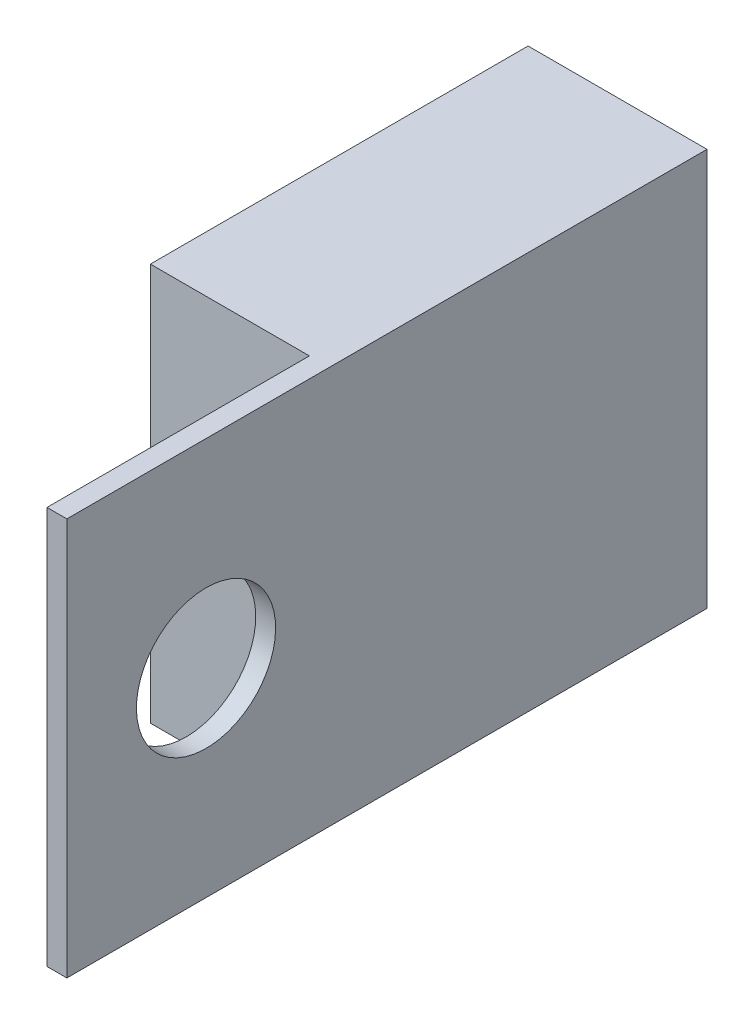
ISO-10303-21;
HEADER;
FILE_DESCRIPTION(('STEP AP214'),'2;1');
FILE_NAME('part.step','',(''),(''),'','','');
FILE_SCHEMA(('AUTOMOTIVE_DESIGN { 1 0 10303 214 1 1 1 1 }'));
ENDSEC;
DATA;
#1=APPLICATION_CONTEXT('core data for automotive mechanical design processes');
#2=APPLICATION_PROTOCOL_DEFINITION('international standard','automotive_design',2000,#1);
#3=PRODUCT_CONTEXT('',#1,'mechanical');
#4=PRODUCT('Part','Part','',(#3));
#5=PRODUCT_RELATED_PRODUCT_CATEGORY('part','',(#4));
#6=PRODUCT_DEFINITION_FORMATION('','',#4);
#7=PRODUCT_DEFINITION_CONTEXT('part definition',#1,'design');
#8=PRODUCT_DEFINITION('design','',#6,#7);
#9=PRODUCT_DEFINITION_SHAPE('','',#8);
#10=(LENGTH_UNIT() NAMED_UNIT(*) SI_UNIT(.MILLI.,.METRE.));
#11=(NAMED_UNIT(*) PLANE_ANGLE_UNIT() SI_UNIT($,.RADIAN.));
#12=(NAMED_UNIT(*) SI_UNIT($,.STERADIAN.) SOLID_ANGLE_UNIT());
#13=UNCERTAINTY_MEASURE_WITH_UNIT(LENGTH_MEASURE(1.E-05),#10,'distance_accuracy_value','');
#14=(GEOMETRIC_REPRESENTATION_CONTEXT(3) GLOBAL_UNCERTAINTY_ASSIGNED_CONTEXT((#13)) GLOBAL_UNIT_ASSIGNED_CONTEXT((#10,
#11,#12)) REPRESENTATION_CONTEXT('',''));
#15=CARTESIAN_POINT('',(0.,0.,0.));
#16=DIRECTION('',(0.,0.,1.));
#17=DIRECTION('',(1.,0.,0.));
#18=AXIS2_PLACEMENT_3D('',#15,#16,#17);
#19=CARTESIAN_POINT('',(-45.3217987061,12.6154747009,17.2));
#20=DIRECTION('',(1.,0.,0.));
#21=DIRECTION('',(0.,0.87758256189038,0.479425538604189));
#22=AXIS2_PLACEMENT_3D('',#19,#20,#21);
#23=CYLINDRICAL_SURFACE('',#22,1.75);
#24=CARTESIAN_POINT('',(49.1288757324,12.6154747009,17.2));
#25=DIRECTION('',(-1.,0.,0.));
#26=DIRECTION('',(0.,0.877582561879051,0.479425538624928));
#27=AXIS2_PLACEMENT_3D('',#24,#25,#26);
#28=CIRCLE('',#27,1.75);
#29=CARTESIAN_POINT('',(49.1288757324,14.1512441841883,18.0389946925936));
#30=VERTEX_POINT('',#29);
#31=EDGE_CURVE('E98',#30,#30,#28,.T.);
#32=ORIENTED_EDGE('',*,*,#31,.F.);
#33=EDGE_LOOP('',(#32));
#34=FACE_BOUND('',#33,.T.);
#35=CARTESIAN_POINT('',(48.6288757324,12.6154747009,17.2));
#36=DIRECTION('',(1.,0.,0.));
#37=DIRECTION('',(0.,-0.877582561879051,-0.479425538624928));
#38=AXIS2_PLACEMENT_3D('',#35,#36,#37);
#39=CIRCLE('',#38,1.75);
#40=CARTESIAN_POINT('',(48.6288757324,11.0797052176117,16.3610053074064));
#41=VERTEX_POINT('',#40);
#42=EDGE_CURVE('E114',#41,#41,#39,.T.);
#43=ORIENTED_EDGE('',*,*,#42,.F.);
#44=EDGE_LOOP('',(#43));
#45=FACE_BOUND('',#44,.T.);
#46=ADVANCED_FACE('F17',(#34,#45),#23,.F.);
#47=CARTESIAN_POINT('',(48.6288757324,7.61547470093,14.1));
#48=DIRECTION('',(1.,0.,0.));
#49=DIRECTION('',(0.,1.,0.));
#50=AXIS2_PLACEMENT_3D('',#47,#48,#49);
#51=PLANE('',#50);
#52=DIRECTION('',(0.,1.,0.));
#53=VECTOR('',#52,1.);
#54=CARTESIAN_POINT('',(48.6288757324,7.61547470093,14.1));
#55=LINE('',#54,#53);
#56=CARTESIAN_POINT('',(48.6288757324,7.61547470093,14.1));
#57=VERTEX_POINT('',#56);
#58=CARTESIAN_POINT('',(48.6288757324,17.6154747009,14.1));
#59=VERTEX_POINT('',#58);
#60=EDGE_CURVE('E36',#57,#59,#55,.T.);
#61=ORIENTED_EDGE('',*,*,#60,.F.);
#62=DIRECTION('',(0.,0.,-1.));
#63=VECTOR('',#62,1.);
#64=CARTESIAN_POINT('',(48.6288757324,7.61547470093,20.7));
#65=LINE('',#64,#63);
#66=CARTESIAN_POINT('',(48.6288757324,7.61547470093,20.7));
#67=VERTEX_POINT('',#66);
#68=EDGE_CURVE('E81',#67,#57,#65,.T.);
#69=ORIENTED_EDGE('',*,*,#68,.F.);
#70=DIRECTION('',(0.,1.,0.));
#71=VECTOR('',#70,1.);
#72=CARTESIAN_POINT('',(48.6288757324,7.61547470093,20.7));
#73=LINE('',#72,#71);
#74=CARTESIAN_POINT('',(48.6288757324,17.6154747009,20.7));
#75=VERTEX_POINT('',#74);
#76=EDGE_CURVE('E11',#67,#75,#73,.T.);
#77=ORIENTED_EDGE('',*,*,#76,.T.);
#78=DIRECTION('',(0.,0.,-1.));
#79=VECTOR('',#78,1.);
#80=CARTESIAN_POINT('',(48.6288757324,17.6154747009,20.7));
#81=LINE('',#80,#79);
#82=EDGE_CURVE('E27',#75,#59,#81,.T.);
#83=ORIENTED_EDGE('',*,*,#82,.T.);
#84=EDGE_LOOP('',(#61,#69,#77,#83));
#85=FACE_BOUND('',#84,.T.);
#86=ORIENTED_EDGE('',*,*,#42,.T.);
#87=EDGE_LOOP('',(#86));
#88=FACE_BOUND('',#87,.T.);
#89=ADVANCED_FACE('F128',(#85,#88),#51,.F.);
#90=CARTESIAN_POINT('',(-45.4217987061,17.6154747009,1.6));
#91=DIRECTION('',(0.,-1.,0.));
#92=DIRECTION('',(1.,0.,0.));
#93=AXIS2_PLACEMENT_3D('',#90,#91,#92);
#94=PLANE('',#93);
#95=DIRECTION('',(1.,0.,0.));
#96=VECTOR('',#95,1.);
#97=CARTESIAN_POINT('',(44.6288757324,17.6154747009,4.6));
#98=LINE('',#97,#96);
#99=CARTESIAN_POINT('',(44.6288757324,17.6154747009,4.6));
#100=VERTEX_POINT('',#99);
#101=CARTESIAN_POINT('',(49.1288757324,17.6154747009,4.6));
#102=VERTEX_POINT('',#101);
#103=EDGE_CURVE('E92',#100,#102,#98,.T.);
#104=ORIENTED_EDGE('',*,*,#103,.F.);
#105=DIRECTION('',(0.,0.,-1.));
#106=VECTOR('',#105,1.);
#107=CARTESIAN_POINT('',(44.6288757324,17.6154747009,14.1));
#108=LINE('',#107,#106);
#109=CARTESIAN_POINT('',(44.6288757324,17.6154747009,14.1));
#110=VERTEX_POINT('',#109);
#111=EDGE_CURVE('E90',#110,#100,#108,.T.);
#112=ORIENTED_EDGE('',*,*,#111,.F.);
#113=DIRECTION('',(1.,0.,0.));
#114=VECTOR('',#113,1.);
#115=CARTESIAN_POINT('',(44.6288757324,17.6154747009,14.1));
#116=LINE('',#115,#114);
#117=EDGE_CURVE('E111',#110,#59,#116,.T.);
#118=ORIENTED_EDGE('',*,*,#117,.T.);
#119=ORIENTED_EDGE('',*,*,#82,.F.);
#120=DIRECTION('',(1.,0.,0.));
#121=VECTOR('',#120,1.);
#122=CARTESIAN_POINT('',(48.6288757324,17.6154747009,20.7));
#123=LINE('',#122,#121);
#124=CARTESIAN_POINT('',(49.1288757324,17.6154747009,20.7));
#125=VERTEX_POINT('',#124);
#126=EDGE_CURVE('E108',#75,#125,#123,.T.);
#127=ORIENTED_EDGE('',*,*,#126,.T.);
#128=DIRECTION('',(0.,0.,-1.));
#129=VECTOR('',#128,1.);
#130=CARTESIAN_POINT('',(49.1288757324,17.6154747009,20.7));
#131=LINE('',#130,#129);
#132=EDGE_CURVE('E104',#125,#102,#131,.T.);
#133=ORIENTED_EDGE('',*,*,#132,.T.);
#134=EDGE_LOOP('',(#104,#112,#118,#119,#127,#133));
#135=FACE_BOUND('',#134,.T.);
#136=ADVANCED_FACE('F133',(#135),#94,.F.);
#137=CARTESIAN_POINT('',(49.1288757324,17.6154747009,1.6));
#138=DIRECTION('',(-1.,0.,0.));
#139=DIRECTION('',(0.,-1.,0.));
#140=AXIS2_PLACEMENT_3D('',#137,#138,#139);
#141=PLANE('',#140);
#142=DIRECTION('',(0.,-1.,0.));
#143=VECTOR('',#142,1.);
#144=CARTESIAN_POINT('',(49.1288757324,17.6154747009,4.6));
#145=LINE('',#144,#143);
#146=CARTESIAN_POINT('',(49.1288757324,7.61547470093,4.6));
#147=VERTEX_POINT('',#146);
#148=EDGE_CURVE('E78',#102,#147,#145,.T.);
#149=ORIENTED_EDGE('',*,*,#148,.F.);
#150=ORIENTED_EDGE('',*,*,#132,.F.);
#151=DIRECTION('',(0.,-1.,0.));
#152=VECTOR('',#151,1.);
#153=CARTESIAN_POINT('',(49.1288757324,17.6154747009,20.7));
#154=LINE('',#153,#152);
#155=CARTESIAN_POINT('',(49.1288757324,7.61547470093,20.7));
#156=VERTEX_POINT('',#155);
#157=EDGE_CURVE('E101',#125,#156,#154,.T.);
#158=ORIENTED_EDGE('',*,*,#157,.T.);
#159=DIRECTION('',(0.,0.,-1.));
#160=VECTOR('',#159,1.);
#161=CARTESIAN_POINT('',(49.1288757324,7.61547470093,20.7));
#162=LINE('',#161,#160);
#163=EDGE_CURVE('E99',#156,#147,#162,.T.);
#164=ORIENTED_EDGE('',*,*,#163,.T.);
#165=EDGE_LOOP('',(#149,#150,#158,#164));
#166=FACE_BOUND('',#165,.T.);
#167=ORIENTED_EDGE('',*,*,#31,.T.);
#168=EDGE_LOOP('',(#167));
#169=FACE_BOUND('',#168,.T.);
#170=ADVANCED_FACE('F124',(#166,#169),#141,.F.);
#171=CARTESIAN_POINT('',(-40.9217987061,7.61547470093,1.6));
#172=DIRECTION('',(0.,1.,0.));
#173=DIRECTION('',(-1.,0.,0.));
#174=AXIS2_PLACEMENT_3D('',#171,#172,#173);
#175=PLANE('',#174);
#176=DIRECTION('',(-1.,0.,0.));
#177=VECTOR('',#176,1.);
#178=CARTESIAN_POINT('',(48.6288757324,7.61547470093,14.1));
#179=LINE('',#178,#177);
#180=CARTESIAN_POINT('',(44.6288757324,7.61547470093,14.1));
#181=VERTEX_POINT('',#180);
#182=EDGE_CURVE('E85',#57,#181,#179,.T.);
#183=ORIENTED_EDGE('',*,*,#182,.T.);
#184=DIRECTION('',(0.,0.,-1.));
#185=VECTOR('',#184,1.);
#186=CARTESIAN_POINT('',(44.6288757324,7.61547470093,14.1));
#187=LINE('',#186,#185);
#188=CARTESIAN_POINT('',(44.6288757324,7.61547470093,4.6));
#189=VERTEX_POINT('',#188);
#190=EDGE_CURVE('E68',#181,#189,#187,.T.);
#191=ORIENTED_EDGE('',*,*,#190,.T.);
#192=DIRECTION('',(-1.,0.,0.));
#193=VECTOR('',#192,1.);
#194=CARTESIAN_POINT('',(49.1288757324,7.61547470093,4.6));
#195=LINE('',#194,#193);
#196=EDGE_CURVE('E74',#147,#189,#195,.T.);
#197=ORIENTED_EDGE('',*,*,#196,.F.);
#198=ORIENTED_EDGE('',*,*,#163,.F.);
#199=DIRECTION('',(-1.,0.,0.));
#200=VECTOR('',#199,1.);
#201=CARTESIAN_POINT('',(49.1288757324,7.61547470093,20.7));
#202=LINE('',#201,#200);
#203=EDGE_CURVE('E87',#156,#67,#202,.T.);
#204=ORIENTED_EDGE('',*,*,#203,.T.);
#205=ORIENTED_EDGE('',*,*,#68,.T.);
#206=EDGE_LOOP('',(#183,#191,#197,#198,#204,#205));
#207=FACE_BOUND('',#206,.T.);
#208=ADVANCED_FACE('F83',(#207),#175,.F.);
#209=CARTESIAN_POINT('',(0.,0.,20.7));
#210=DIRECTION('',(0.,0.,1.));
#211=DIRECTION('',(1.,0.,0.));
#212=AXIS2_PLACEMENT_3D('',#209,#210,#211);
#213=PLANE('',#212);
#214=ORIENTED_EDGE('',*,*,#76,.F.);
#215=ORIENTED_EDGE('',*,*,#203,.F.);
#216=ORIENTED_EDGE('',*,*,#157,.F.);
#217=ORIENTED_EDGE('',*,*,#126,.F.);
#218=EDGE_LOOP('',(#214,#215,#216,#217));
#219=FACE_BOUND('',#218,.T.);
#220=ADVANCED_FACE('F147',(#219),#213,.T.);
#221=CARTESIAN_POINT('',(0.,0.,4.6));
#222=DIRECTION('',(0.,0.,1.));
#223=DIRECTION('',(1.,0.,0.));
#224=AXIS2_PLACEMENT_3D('',#221,#222,#223);
#225=PLANE('',#224);
#226=ORIENTED_EDGE('',*,*,#196,.T.);
#227=DIRECTION('',(0.,1.,0.));
#228=VECTOR('',#227,1.);
#229=CARTESIAN_POINT('',(44.6288757324,7.61547470093,4.6));
#230=LINE('',#229,#228);
#231=EDGE_CURVE('E76',#189,#100,#230,.T.);
#232=ORIENTED_EDGE('',*,*,#231,.T.);
#233=ORIENTED_EDGE('',*,*,#103,.T.);
#234=ORIENTED_EDGE('',*,*,#148,.T.);
#235=EDGE_LOOP('',(#226,#232,#233,#234));
#236=FACE_BOUND('',#235,.T.);
#237=ADVANCED_FACE('F75',(#236),#225,.F.);
#238=CARTESIAN_POINT('',(44.6288757324,7.61547470093,1.6));
#239=DIRECTION('',(1.,0.,0.));
#240=DIRECTION('',(0.,1.,0.));
#241=AXIS2_PLACEMENT_3D('',#238,#239,#240);
#242=PLANE('',#241);
#243=ORIENTED_EDGE('',*,*,#231,.F.);
#244=ORIENTED_EDGE('',*,*,#190,.F.);
#245=DIRECTION('',(0.,1.,0.));
#246=VECTOR('',#245,1.);
#247=CARTESIAN_POINT('',(44.6288757324,7.61547470093,14.1));
#248=LINE('',#247,#246);
#249=EDGE_CURVE('E21',#181,#110,#248,.T.);
#250=ORIENTED_EDGE('',*,*,#249,.T.);
#251=ORIENTED_EDGE('',*,*,#111,.T.);
#252=EDGE_LOOP('',(#243,#244,#250,#251));
#253=FACE_BOUND('',#252,.T.);
#254=ADVANCED_FACE('F89',(#253),#242,.F.);
#255=CARTESIAN_POINT('',(0.,0.,14.1));
#256=DIRECTION('',(0.,0.,1.));
#257=DIRECTION('',(1.,0.,0.));
#258=AXIS2_PLACEMENT_3D('',#255,#256,#257);
#259=PLANE('',#258);
#260=ORIENTED_EDGE('',*,*,#249,.F.);
#261=ORIENTED_EDGE('',*,*,#182,.F.);
#262=ORIENTED_EDGE('',*,*,#60,.T.);
#263=ORIENTED_EDGE('',*,*,#117,.F.);
#264=EDGE_LOOP('',(#260,#261,#262,#263));
#265=FACE_BOUND('',#264,.T.);
#266=ADVANCED_FACE('F19',(#265),#259,.T.);
#267=CLOSED_SHELL('',(#46,#89,#136,#170,#208,#220,#237,#254,#266));
#268=MANIFOLD_SOLID_BREP('B1',#267);
#269=ADVANCED_BREP_SHAPE_REPRESENTATION('',(#18,#268),#14);
#270=SHAPE_DEFINITION_REPRESENTATION(#9,#269);
ENDSEC;
END-ISO-10303-21;
